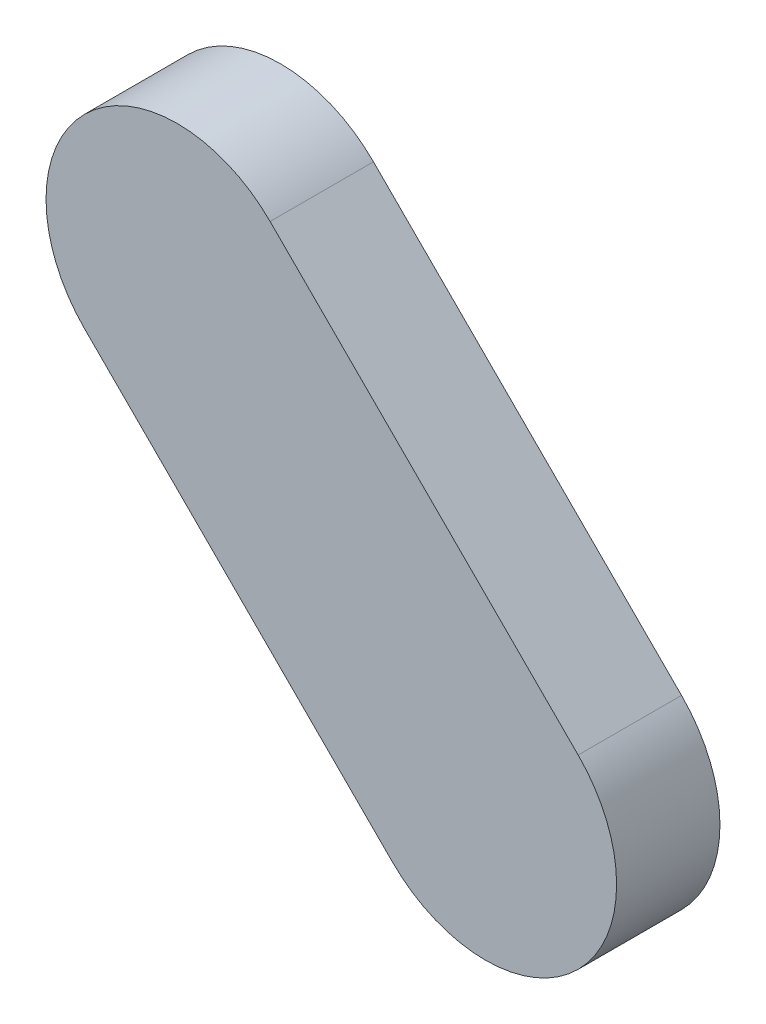
ISO-10303-21;
HEADER;
FILE_DESCRIPTION(('STEP AP214'),'2;1');
FILE_NAME('part.step','',(''),(''),'','','');
FILE_SCHEMA(('AUTOMOTIVE_DESIGN { 1 0 10303 214 1 1 1 1 }'));
ENDSEC;
DATA;
#1=APPLICATION_CONTEXT('core data for automotive mechanical design processes');
#2=APPLICATION_PROTOCOL_DEFINITION('international standard','automotive_design',2000,#1);
#3=PRODUCT_CONTEXT('',#1,'mechanical');
#4=PRODUCT('Part','Part','',(#3));
#5=PRODUCT_RELATED_PRODUCT_CATEGORY('part','',(#4));
#6=PRODUCT_DEFINITION_FORMATION('','',#4);
#7=PRODUCT_DEFINITION_CONTEXT('part definition',#1,'design');
#8=PRODUCT_DEFINITION('design','',#6,#7);
#9=PRODUCT_DEFINITION_SHAPE('','',#8);
#10=(LENGTH_UNIT() NAMED_UNIT(*) SI_UNIT(.MILLI.,.METRE.));
#11=(NAMED_UNIT(*) PLANE_ANGLE_UNIT() SI_UNIT($,.RADIAN.));
#12=(NAMED_UNIT(*) SI_UNIT($,.STERADIAN.) SOLID_ANGLE_UNIT());
#13=UNCERTAINTY_MEASURE_WITH_UNIT(LENGTH_MEASURE(1.E-05),#10,'distance_accuracy_value','');
#14=(GEOMETRIC_REPRESENTATION_CONTEXT(3) GLOBAL_UNCERTAINTY_ASSIGNED_CONTEXT((#13)) GLOBAL_UNIT_ASSIGNED_CONTEXT((#10,
#11,#12)) REPRESENTATION_CONTEXT('',''));
#15=CARTESIAN_POINT('',(0.,0.,0.));
#16=DIRECTION('',(0.,0.,1.));
#17=DIRECTION('',(1.,0.,0.));
#18=AXIS2_PLACEMENT_3D('',#15,#16,#17);
#19=CARTESIAN_POINT('',(92.33288366,66.45654222,0.));
#20=DIRECTION('',(0.707106781186556,0.707106781186539,0.));
#21=DIRECTION('',(0.707106781186539,-0.707106781186556,0.));
#22=AXIS2_PLACEMENT_3D('',#19,#20,#21);
#23=PLANE('',#22);
#24=DIRECTION('',(0.707106781186539,-0.707106781186556,0.));
#25=VECTOR('',#24,1.);
#26=CARTESIAN_POINT('',(92.33288366,66.45654222,0.1999996));
#27=LINE('',#26,#25);
#28=CARTESIAN_POINT('',(92.33288366,66.45654222,0.1999996));
#29=VERTEX_POINT('',#28);
#30=CARTESIAN_POINT('',(92.92903182,65.86039406,0.1999996));
#31=VERTEX_POINT('',#30);
#32=EDGE_CURVE('E11',#29,#31,#27,.T.);
#33=ORIENTED_EDGE('',*,*,#32,.F.);
#34=DIRECTION('',(0.,0.,1.));
#35=VECTOR('',#34,1.);
#36=CARTESIAN_POINT('',(92.33288366,66.45654222,0.));
#37=LINE('',#36,#35);
#38=CARTESIAN_POINT('',(92.33288366,66.45654222,0.));
#39=VERTEX_POINT('',#38);
#40=EDGE_CURVE('E24',#39,#29,#37,.T.);
#41=ORIENTED_EDGE('',*,*,#40,.F.);
#42=DIRECTION('',(0.707106781186539,-0.707106781186556,0.));
#43=VECTOR('',#42,1.);
#44=CARTESIAN_POINT('',(92.33288366,66.45654222,0.));
#45=LINE('',#44,#43);
#46=CARTESIAN_POINT('',(92.92903182,65.86039406,0.));
#47=VERTEX_POINT('',#46);
#48=EDGE_CURVE('E75',#39,#47,#45,.T.);
#49=ORIENTED_EDGE('',*,*,#48,.T.);
#50=DIRECTION('',(0.,0.,1.));
#51=VECTOR('',#50,1.);
#52=CARTESIAN_POINT('',(92.92903182,65.86039406,0.));
#53=LINE('',#52,#51);
#54=EDGE_CURVE('E37',#47,#31,#53,.T.);
#55=ORIENTED_EDGE('',*,*,#54,.T.);
#56=EDGE_LOOP('',(#33,#41,#49,#55));
#57=FACE_BOUND('',#56,.T.);
#58=ADVANCED_FACE('F17',(#57),#23,.F.);
#59=CARTESIAN_POINT('',(93.10863776,66.04,0.));
#60=DIRECTION('',(0.,0.,-1.));
#61=DIRECTION('',(-0.707106781186548,-0.707106781186548,0.));
#62=AXIS2_PLACEMENT_3D('',#59,#60,#61);
#63=CYLINDRICAL_SURFACE('',#62,0.254001156230774);
#64=CARTESIAN_POINT('',(93.10863776,66.04,0.1999996));
#65=DIRECTION('',(0.,0.,1.));
#66=DIRECTION('',(-0.707106781186548,-0.707106781186548,0.));
#67=AXIS2_PLACEMENT_3D('',#64,#65,#66);
#68=CIRCLE('',#67,0.254001156230774);
#69=CARTESIAN_POINT('',(93.2882437,66.21960594,0.1999996));
#70=VERTEX_POINT('',#69);
#71=EDGE_CURVE('E83',#31,#70,#68,.T.);
#72=ORIENTED_EDGE('',*,*,#71,.F.);
#73=ORIENTED_EDGE('',*,*,#54,.F.);
#74=CARTESIAN_POINT('',(93.10863776,66.04,0.));
#75=DIRECTION('',(0.,0.,1.));
#76=DIRECTION('',(-0.707106781186548,-0.707106781186548,0.));
#77=AXIS2_PLACEMENT_3D('',#74,#75,#76);
#78=CIRCLE('',#77,0.254001156230774);
#79=CARTESIAN_POINT('',(93.2882437,66.21960594,0.));
#80=VERTEX_POINT('',#79);
#81=EDGE_CURVE('E81',#47,#80,#78,.T.);
#82=ORIENTED_EDGE('',*,*,#81,.T.);
#83=DIRECTION('',(0.,0.,1.));
#84=VECTOR('',#83,1.);
#85=CARTESIAN_POINT('',(93.2882437,66.21960594,0.));
#86=LINE('',#85,#84);
#87=EDGE_CURVE('E67',#80,#70,#86,.T.);
#88=ORIENTED_EDGE('',*,*,#87,.T.);
#89=EDGE_LOOP('',(#72,#73,#82,#88));
#90=FACE_BOUND('',#89,.T.);
#91=ADVANCED_FACE('F89',(#90),#63,.T.);
#92=CARTESIAN_POINT('',(93.2882437,66.21960594,0.));
#93=DIRECTION('',(-0.707106781186539,-0.707106781186556,0.));
#94=DIRECTION('',(-0.707106781186556,0.707106781186539,0.));
#95=AXIS2_PLACEMENT_3D('',#92,#93,#94);
#96=PLANE('',#95);
#97=DIRECTION('',(-0.707106781186556,0.707106781186539,0.));
#98=VECTOR('',#97,1.);
#99=CARTESIAN_POINT('',(93.2882437,66.21960594,0.1999996));
#100=LINE('',#99,#98);
#101=CARTESIAN_POINT('',(92.69209554,66.8157541,0.1999996));
#102=VERTEX_POINT('',#101);
#103=EDGE_CURVE('E71',#70,#102,#100,.T.);
#104=ORIENTED_EDGE('',*,*,#103,.F.);
#105=ORIENTED_EDGE('',*,*,#87,.F.);
#106=DIRECTION('',(-0.707106781186556,0.707106781186539,0.));
#107=VECTOR('',#106,1.);
#108=CARTESIAN_POINT('',(93.2882437,66.21960594,0.));
#109=LINE('',#108,#107);
#110=CARTESIAN_POINT('',(92.69209554,66.8157541,0.));
#111=VERTEX_POINT('',#110);
#112=EDGE_CURVE('E63',#80,#111,#109,.T.);
#113=ORIENTED_EDGE('',*,*,#112,.T.);
#114=DIRECTION('',(0.,0.,1.));
#115=VECTOR('',#114,1.);
#116=CARTESIAN_POINT('',(92.69209554,66.8157541,0.));
#117=LINE('',#116,#115);
#118=EDGE_CURVE('E53',#111,#102,#117,.T.);
#119=ORIENTED_EDGE('',*,*,#118,.T.);
#120=EDGE_LOOP('',(#104,#105,#113,#119));
#121=FACE_BOUND('',#120,.T.);
#122=ADVANCED_FACE('F66',(#121),#96,.F.);
#123=CARTESIAN_POINT('',(92.5124896,66.63614816,0.));
#124=DIRECTION('',(0.,0.,-1.));
#125=DIRECTION('',(0.707106781186576,0.70710678118652,0.));
#126=AXIS2_PLACEMENT_3D('',#123,#124,#125);
#127=CYLINDRICAL_SURFACE('',#126,0.254001156230764);
#128=CARTESIAN_POINT('',(92.5124896,66.63614816,0.1999996));
#129=DIRECTION('',(0.,0.,1.));
#130=DIRECTION('',(0.707106781186576,0.70710678118652,0.));
#131=AXIS2_PLACEMENT_3D('',#128,#129,#130);
#132=CIRCLE('',#131,0.254001156230764);
#133=EDGE_CURVE('E59',#102,#29,#132,.T.);
#134=ORIENTED_EDGE('',*,*,#133,.F.);
#135=ORIENTED_EDGE('',*,*,#118,.F.);
#136=CARTESIAN_POINT('',(92.5124896,66.63614816,0.));
#137=DIRECTION('',(0.,0.,1.));
#138=DIRECTION('',(0.707106781186576,0.70710678118652,0.));
#139=AXIS2_PLACEMENT_3D('',#136,#137,#138);
#140=CIRCLE('',#139,0.254001156230764);
#141=EDGE_CURVE('E57',#111,#39,#140,.T.);
#142=ORIENTED_EDGE('',*,*,#141,.T.);
#143=ORIENTED_EDGE('',*,*,#40,.T.);
#144=EDGE_LOOP('',(#134,#135,#142,#143));
#145=FACE_BOUND('',#144,.T.);
#146=ADVANCED_FACE('F55',(#145),#127,.T.);
#147=CARTESIAN_POINT('',(92.33288366,66.45654222,0.));
#148=DIRECTION('',(0.,0.,-1.));
#149=DIRECTION('',(-1.,0.,0.));
#150=AXIS2_PLACEMENT_3D('',#147,#148,#149);
#151=PLANE('',#150);
#152=ORIENTED_EDGE('',*,*,#141,.F.);
#153=ORIENTED_EDGE('',*,*,#112,.F.);
#154=ORIENTED_EDGE('',*,*,#81,.F.);
#155=ORIENTED_EDGE('',*,*,#48,.F.);
#156=EDGE_LOOP('',(#152,#153,#154,#155));
#157=FACE_BOUND('',#156,.T.);
#158=ADVANCED_FACE('F74',(#157),#151,.T.);
#159=CARTESIAN_POINT('',(92.33288366,66.45654222,0.1999996));
#160=DIRECTION('',(0.,0.,-1.));
#161=DIRECTION('',(-1.,0.,0.));
#162=AXIS2_PLACEMENT_3D('',#159,#160,#161);
#163=PLANE('',#162);
#164=ORIENTED_EDGE('',*,*,#32,.T.);
#165=ORIENTED_EDGE('',*,*,#71,.T.);
#166=ORIENTED_EDGE('',*,*,#103,.T.);
#167=ORIENTED_EDGE('',*,*,#133,.T.);
#168=EDGE_LOOP('',(#164,#165,#166,#167));
#169=FACE_BOUND('',#168,.T.);
#170=ADVANCED_FACE('F91',(#169),#163,.F.);
#171=CLOSED_SHELL('',(#58,#91,#122,#146,#158,#170));
#172=MANIFOLD_SOLID_BREP('B1',#171);
#173=ADVANCED_BREP_SHAPE_REPRESENTATION('',(#18,#172),#14);
#174=SHAPE_DEFINITION_REPRESENTATION(#9,#173);
ENDSEC;
END-ISO-10303-21;
